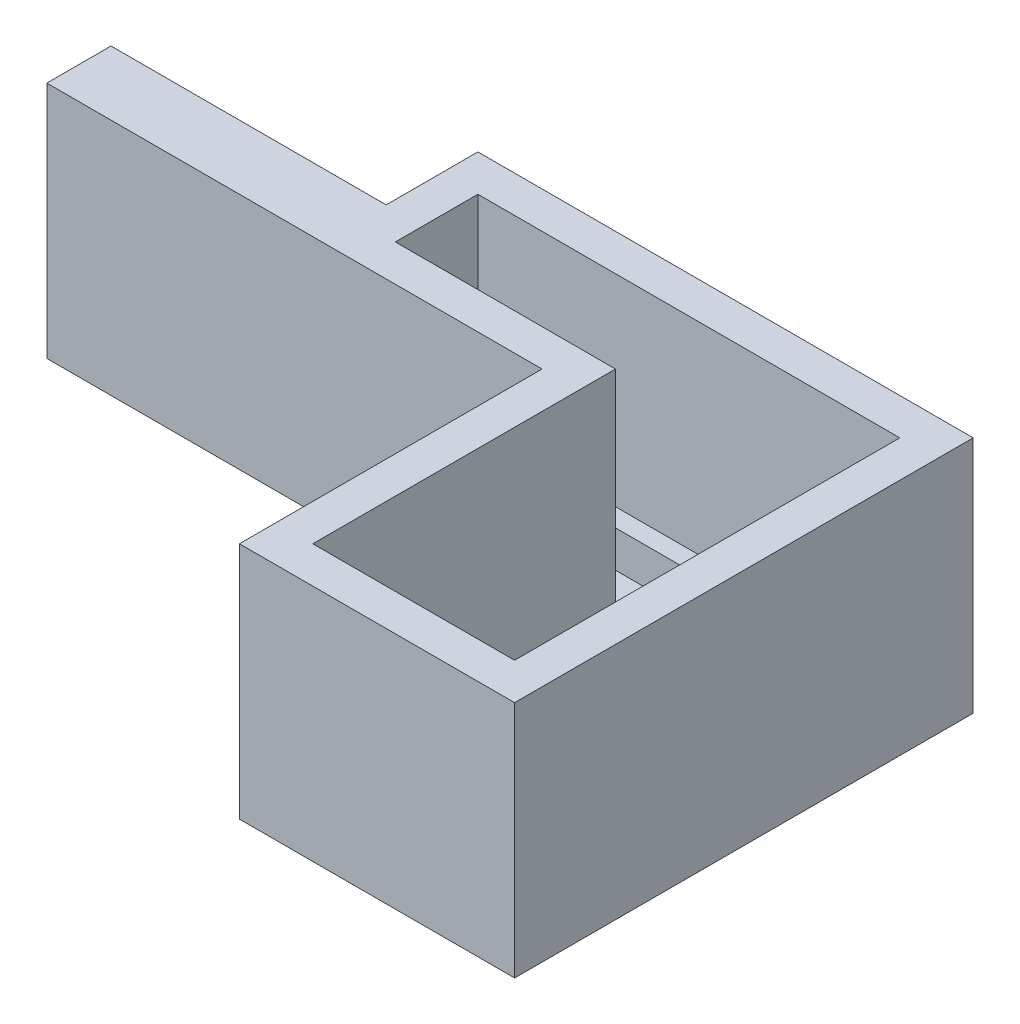
ISO-10303-21;
HEADER;
FILE_DESCRIPTION(('STEP AP214'),'2;1');
FILE_NAME('part.step','',(''),(''),'','','');
FILE_SCHEMA(('AUTOMOTIVE_DESIGN { 1 0 10303 214 1 1 1 1 }'));
ENDSEC;
DATA;
#1=APPLICATION_CONTEXT('core data for automotive mechanical design processes');
#2=APPLICATION_PROTOCOL_DEFINITION('international standard','automotive_design',2000,#1);
#3=PRODUCT_CONTEXT('',#1,'mechanical');
#4=PRODUCT('Part','Part','',(#3));
#5=PRODUCT_RELATED_PRODUCT_CATEGORY('part','',(#4));
#6=PRODUCT_DEFINITION_FORMATION('','',#4);
#7=PRODUCT_DEFINITION_CONTEXT('part definition',#1,'design');
#8=PRODUCT_DEFINITION('design','',#6,#7);
#9=PRODUCT_DEFINITION_SHAPE('','',#8);
#10=(LENGTH_UNIT() NAMED_UNIT(*) SI_UNIT(.MILLI.,.METRE.));
#11=(NAMED_UNIT(*) PLANE_ANGLE_UNIT() SI_UNIT($,.RADIAN.));
#12=(NAMED_UNIT(*) SI_UNIT($,.STERADIAN.) SOLID_ANGLE_UNIT());
#13=UNCERTAINTY_MEASURE_WITH_UNIT(LENGTH_MEASURE(1.E-05),#10,'distance_accuracy_value','');
#14=(GEOMETRIC_REPRESENTATION_CONTEXT(3) GLOBAL_UNCERTAINTY_ASSIGNED_CONTEXT((#13)) GLOBAL_UNIT_ASSIGNED_CONTEXT((#10,
#11,#12)) REPRESENTATION_CONTEXT('',''));
#15=CARTESIAN_POINT('',(0.,0.,0.));
#16=DIRECTION('',(0.,0.,1.));
#17=DIRECTION('',(1.,0.,0.));
#18=AXIS2_PLACEMENT_3D('',#15,#16,#17);
#19=CARTESIAN_POINT('',(0.,13.,0.));
#20=DIRECTION('',(-1.,0.,0.));
#21=DIRECTION('',(0.,0.,1.));
#22=AXIS2_PLACEMENT_3D('',#19,#20,#21);
#23=PLANE('',#22);
#24=DIRECTION('',(0.,0.,-1.));
#25=VECTOR('',#24,1.);
#26=CARTESIAN_POINT('',(0.,0.,0.));
#27=LINE('',#26,#25);
#28=CARTESIAN_POINT('',(0.,0.,11.));
#29=VERTEX_POINT('',#28);
#30=CARTESIAN_POINT('',(0.,0.,-14.));
#31=VERTEX_POINT('',#30);
#32=EDGE_CURVE('E244',#29,#31,#27,.T.);
#33=ORIENTED_EDGE('',*,*,#32,.T.);
#34=DIRECTION('',(0.,-1.,0.));
#35=VECTOR('',#34,1.);
#36=CARTESIAN_POINT('',(0.,13.,-14.));
#37=LINE('',#36,#35);
#38=CARTESIAN_POINT('',(0.,13.,-14.));
#39=VERTEX_POINT('',#38);
#40=EDGE_CURVE('E12',#39,#31,#37,.T.);
#41=ORIENTED_EDGE('',*,*,#40,.F.);
#42=DIRECTION('',(0.,0.,-1.));
#43=VECTOR('',#42,1.);
#44=CARTESIAN_POINT('',(0.,13.,0.));
#45=LINE('',#44,#43);
#46=CARTESIAN_POINT('',(0.,13.,11.));
#47=VERTEX_POINT('',#46);
#48=EDGE_CURVE('E245',#47,#39,#45,.T.);
#49=ORIENTED_EDGE('',*,*,#48,.F.);
#50=DIRECTION('',(0.,-1.,0.));
#51=VECTOR('',#50,1.);
#52=CARTESIAN_POINT('',(0.,13.,11.));
#53=LINE('',#52,#51);
#54=EDGE_CURVE('E262',#47,#29,#53,.T.);
#55=ORIENTED_EDGE('',*,*,#54,.T.);
#56=EDGE_LOOP('',(#33,#41,#49,#55));
#57=FACE_BOUND('',#56,.T.);
#58=ADVANCED_FACE('F37',(#57),#23,.F.);
#59=CARTESIAN_POINT('',(0.,13.,-14.));
#60=DIRECTION('',(0.,0.,1.));
#61=DIRECTION('',(1.,0.,0.));
#62=AXIS2_PLACEMENT_3D('',#59,#60,#61);
#63=PLANE('',#62);
#64=DIRECTION('',(-1.,0.,0.));
#65=VECTOR('',#64,1.);
#66=CARTESIAN_POINT('',(0.,0.,-14.));
#67=LINE('',#66,#65);
#68=CARTESIAN_POINT('',(-27.,0.,-14.));
#69=VERTEX_POINT('',#68);
#70=EDGE_CURVE('E264',#31,#69,#67,.T.);
#71=ORIENTED_EDGE('',*,*,#70,.T.);
#72=DIRECTION('',(0.,-1.,0.));
#73=VECTOR('',#72,1.);
#74=CARTESIAN_POINT('',(-27.,13.,-14.));
#75=LINE('',#74,#73);
#76=CARTESIAN_POINT('',(-27.,13.,-14.));
#77=VERTEX_POINT('',#76);
#78=EDGE_CURVE('E44',#77,#69,#75,.T.);
#79=ORIENTED_EDGE('',*,*,#78,.F.);
#80=DIRECTION('',(-1.,0.,0.));
#81=VECTOR('',#80,1.);
#82=CARTESIAN_POINT('',(0.,13.,-14.));
#83=LINE('',#82,#81);
#84=EDGE_CURVE('E247',#39,#77,#83,.T.);
#85=ORIENTED_EDGE('',*,*,#84,.F.);
#86=ORIENTED_EDGE('',*,*,#40,.T.);
#87=EDGE_LOOP('',(#71,#79,#85,#86));
#88=FACE_BOUND('',#87,.T.);
#89=ADVANCED_FACE('F323',(#88),#63,.F.);
#90=CARTESIAN_POINT('',(-27.,13.,-14.));
#91=DIRECTION('',(1.,0.,0.));
#92=DIRECTION('',(0.,0.,-1.));
#93=AXIS2_PLACEMENT_3D('',#90,#91,#92);
#94=PLANE('',#93);
#95=DIRECTION('',(0.,0.,1.));
#96=VECTOR('',#95,1.);
#97=CARTESIAN_POINT('',(-27.,0.,-14.));
#98=LINE('',#97,#96);
#99=CARTESIAN_POINT('',(-27.,0.,-9.00000000000001));
#100=VERTEX_POINT('',#99);
#101=EDGE_CURVE('E266',#69,#100,#98,.T.);
#102=ORIENTED_EDGE('',*,*,#101,.T.);
#103=DIRECTION('',(0.,-1.,0.));
#104=VECTOR('',#103,1.);
#105=CARTESIAN_POINT('',(-27.,13.,-9.00000000000001));
#106=LINE('',#105,#104);
#107=CARTESIAN_POINT('',(-27.,13.,-9.00000000000001));
#108=VERTEX_POINT('',#107);
#109=EDGE_CURVE('E292',#108,#100,#106,.T.);
#110=ORIENTED_EDGE('',*,*,#109,.F.);
#111=DIRECTION('',(0.,0.,1.));
#112=VECTOR('',#111,1.);
#113=CARTESIAN_POINT('',(-27.,13.,-14.));
#114=LINE('',#113,#112);
#115=EDGE_CURVE('E250',#77,#108,#114,.T.);
#116=ORIENTED_EDGE('',*,*,#115,.F.);
#117=ORIENTED_EDGE('',*,*,#78,.T.);
#118=EDGE_LOOP('',(#102,#110,#116,#117));
#119=FACE_BOUND('',#118,.T.);
#120=ADVANCED_FACE('F299',(#119),#94,.F.);
#121=CARTESIAN_POINT('',(-27.,13.,-9.00000000000001));
#122=DIRECTION('',(0.,0.,1.));
#123=DIRECTION('',(1.,0.,0.));
#124=AXIS2_PLACEMENT_3D('',#121,#122,#123);
#125=PLANE('',#124);
#126=DIRECTION('',(-1.,0.,0.));
#127=VECTOR('',#126,1.);
#128=CARTESIAN_POINT('',(-27.,0.,-9.00000000000001));
#129=LINE('',#128,#127);
#130=CARTESIAN_POINT('',(-42.,0.,-9.00000000000001));
#131=VERTEX_POINT('',#130);
#132=EDGE_CURVE('E268',#100,#131,#129,.T.);
#133=ORIENTED_EDGE('',*,*,#132,.T.);
#134=DIRECTION('',(0.,-1.,0.));
#135=VECTOR('',#134,1.);
#136=CARTESIAN_POINT('',(-42.,13.,-9.00000000000001));
#137=LINE('',#136,#135);
#138=CARTESIAN_POINT('',(-42.,13.,-9.00000000000001));
#139=VERTEX_POINT('',#138);
#140=EDGE_CURVE('E289',#139,#131,#137,.T.);
#141=ORIENTED_EDGE('',*,*,#140,.F.);
#142=DIRECTION('',(-1.,0.,0.));
#143=VECTOR('',#142,1.);
#144=CARTESIAN_POINT('',(-27.,13.,-9.00000000000001));
#145=LINE('',#144,#143);
#146=EDGE_CURVE('E252',#108,#139,#145,.T.);
#147=ORIENTED_EDGE('',*,*,#146,.F.);
#148=ORIENTED_EDGE('',*,*,#109,.T.);
#149=EDGE_LOOP('',(#133,#141,#147,#148));
#150=FACE_BOUND('',#149,.T.);
#151=ADVANCED_FACE('F311',(#150),#125,.F.);
#152=CARTESIAN_POINT('',(-42.,13.,-9.00000000000001));
#153=DIRECTION('',(1.,0.,0.));
#154=DIRECTION('',(0.,0.,-1.));
#155=AXIS2_PLACEMENT_3D('',#152,#153,#154);
#156=PLANE('',#155);
#157=DIRECTION('',(0.,0.,1.));
#158=VECTOR('',#157,1.);
#159=CARTESIAN_POINT('',(-42.,0.,-9.00000000000001));
#160=LINE('',#159,#158);
#161=CARTESIAN_POINT('',(-42.,0.,-5.50000000000001));
#162=VERTEX_POINT('',#161);
#163=EDGE_CURVE('E270',#131,#162,#160,.T.);
#164=ORIENTED_EDGE('',*,*,#163,.T.);
#165=DIRECTION('',(0.,-1.,0.));
#166=VECTOR('',#165,1.);
#167=CARTESIAN_POINT('',(-42.,13.,-5.50000000000001));
#168=LINE('',#167,#166);
#169=CARTESIAN_POINT('',(-42.,13.,-5.50000000000001));
#170=VERTEX_POINT('',#169);
#171=EDGE_CURVE('E286',#170,#162,#168,.T.);
#172=ORIENTED_EDGE('',*,*,#171,.F.);
#173=DIRECTION('',(0.,0.,1.));
#174=VECTOR('',#173,1.);
#175=CARTESIAN_POINT('',(-42.,13.,-9.00000000000001));
#176=LINE('',#175,#174);
#177=EDGE_CURVE('E254',#139,#170,#176,.T.);
#178=ORIENTED_EDGE('',*,*,#177,.F.);
#179=ORIENTED_EDGE('',*,*,#140,.T.);
#180=EDGE_LOOP('',(#164,#172,#178,#179));
#181=FACE_BOUND('',#180,.T.);
#182=ADVANCED_FACE('F315',(#181),#156,.F.);
#183=CARTESIAN_POINT('',(-42.,13.,-5.50000000000001));
#184=DIRECTION('',(0.,0.,-1.));
#185=DIRECTION('',(-1.,0.,0.));
#186=AXIS2_PLACEMENT_3D('',#183,#184,#185);
#187=PLANE('',#186);
#188=DIRECTION('',(1.,0.,0.));
#189=VECTOR('',#188,1.);
#190=CARTESIAN_POINT('',(-42.,0.,-5.50000000000001));
#191=LINE('',#190,#189);
#192=CARTESIAN_POINT('',(-15.,0.,-5.50000000000001));
#193=VERTEX_POINT('',#192);
#194=EDGE_CURVE('E272',#162,#193,#191,.T.);
#195=ORIENTED_EDGE('',*,*,#194,.T.);
#196=DIRECTION('',(0.,-1.,0.));
#197=VECTOR('',#196,1.);
#198=CARTESIAN_POINT('',(-15.,13.,-5.50000000000001));
#199=LINE('',#198,#197);
#200=CARTESIAN_POINT('',(-15.,13.,-5.50000000000001));
#201=VERTEX_POINT('',#200);
#202=EDGE_CURVE('E283',#201,#193,#199,.T.);
#203=ORIENTED_EDGE('',*,*,#202,.F.);
#204=DIRECTION('',(1.,0.,0.));
#205=VECTOR('',#204,1.);
#206=CARTESIAN_POINT('',(-42.,13.,-5.50000000000001));
#207=LINE('',#206,#205);
#208=EDGE_CURVE('E256',#170,#201,#207,.T.);
#209=ORIENTED_EDGE('',*,*,#208,.F.);
#210=ORIENTED_EDGE('',*,*,#171,.T.);
#211=EDGE_LOOP('',(#195,#203,#209,#210));
#212=FACE_BOUND('',#211,.T.);
#213=ADVANCED_FACE('F336',(#212),#187,.F.);
#214=CARTESIAN_POINT('',(-15.,13.,11.));
#215=DIRECTION('',(1.,0.,0.));
#216=DIRECTION('',(0.,0.,-1.));
#217=AXIS2_PLACEMENT_3D('',#214,#215,#216);
#218=PLANE('',#217);
#219=DIRECTION('',(0.,0.,1.));
#220=VECTOR('',#219,1.);
#221=CARTESIAN_POINT('',(-15.,0.,11.));
#222=LINE('',#221,#220);
#223=CARTESIAN_POINT('',(-15.,0.,11.));
#224=VERTEX_POINT('',#223);
#225=EDGE_CURVE('E274',#193,#224,#222,.T.);
#226=ORIENTED_EDGE('',*,*,#225,.T.);
#227=DIRECTION('',(0.,-1.,0.));
#228=VECTOR('',#227,1.);
#229=CARTESIAN_POINT('',(-15.,13.,11.));
#230=LINE('',#229,#228);
#231=CARTESIAN_POINT('',(-15.,13.,11.));
#232=VERTEX_POINT('',#231);
#233=EDGE_CURVE('E280',#232,#224,#230,.T.);
#234=ORIENTED_EDGE('',*,*,#233,.F.);
#235=DIRECTION('',(0.,0.,1.));
#236=VECTOR('',#235,1.);
#237=CARTESIAN_POINT('',(-15.,13.,11.));
#238=LINE('',#237,#236);
#239=EDGE_CURVE('E258',#201,#232,#238,.T.);
#240=ORIENTED_EDGE('',*,*,#239,.F.);
#241=ORIENTED_EDGE('',*,*,#202,.T.);
#242=EDGE_LOOP('',(#226,#234,#240,#241));
#243=FACE_BOUND('',#242,.T.);
#244=ADVANCED_FACE('F334',(#243),#218,.F.);
#245=CARTESIAN_POINT('',(0.,13.,11.));
#246=DIRECTION('',(0.,0.,-1.));
#247=DIRECTION('',(-1.,0.,0.));
#248=AXIS2_PLACEMENT_3D('',#245,#246,#247);
#249=PLANE('',#248);
#250=DIRECTION('',(1.,0.,0.));
#251=VECTOR('',#250,1.);
#252=CARTESIAN_POINT('',(0.,0.,11.));
#253=LINE('',#252,#251);
#254=EDGE_CURVE('E248',#224,#29,#253,.T.);
#255=ORIENTED_EDGE('',*,*,#254,.T.);
#256=ORIENTED_EDGE('',*,*,#54,.F.);
#257=DIRECTION('',(1.,0.,0.));
#258=VECTOR('',#257,1.);
#259=CARTESIAN_POINT('',(0.,13.,11.));
#260=LINE('',#259,#258);
#261=EDGE_CURVE('E260',#232,#47,#260,.T.);
#262=ORIENTED_EDGE('',*,*,#261,.F.);
#263=ORIENTED_EDGE('',*,*,#233,.T.);
#264=EDGE_LOOP('',(#255,#256,#262,#263));
#265=FACE_BOUND('',#264,.T.);
#266=ADVANCED_FACE('F329',(#265),#249,.F.);
#267=CARTESIAN_POINT('',(0.,13.,0.));
#268=DIRECTION('',(0.,-1.,0.));
#269=DIRECTION('',(0.,0.,-1.));
#270=AXIS2_PLACEMENT_3D('',#267,#268,#269);
#271=PLANE('',#270);
#272=DIRECTION('',(0.,0.,1.));
#273=VECTOR('',#272,1.);
#274=CARTESIAN_POINT('',(-25.,13.,-12.));
#275=LINE('',#274,#273);
#276=CARTESIAN_POINT('',(-25.,13.,-12.));
#277=VERTEX_POINT('',#276);
#278=CARTESIAN_POINT('',(-25.,13.,-7.50000000000001));
#279=VERTEX_POINT('',#278);
#280=EDGE_CURVE('E206',#277,#279,#275,.T.);
#281=ORIENTED_EDGE('',*,*,#280,.F.);
#282=DIRECTION('',(-1.,0.,0.));
#283=VECTOR('',#282,1.);
#284=CARTESIAN_POINT('',(-2.,13.,-12.));
#285=LINE('',#284,#283);
#286=CARTESIAN_POINT('',(-2.,13.,-12.));
#287=VERTEX_POINT('',#286);
#288=EDGE_CURVE('E209',#287,#277,#285,.T.);
#289=ORIENTED_EDGE('',*,*,#288,.F.);
#290=DIRECTION('',(0.,0.,-1.));
#291=VECTOR('',#290,1.);
#292=CARTESIAN_POINT('',(-2.,13.,8.99999999999999));
#293=LINE('',#292,#291);
#294=CARTESIAN_POINT('',(-2.,13.,8.99999999999999));
#295=VERTEX_POINT('',#294);
#296=EDGE_CURVE('E196',#295,#287,#293,.T.);
#297=ORIENTED_EDGE('',*,*,#296,.F.);
#298=DIRECTION('',(1.,0.,0.));
#299=VECTOR('',#298,1.);
#300=CARTESIAN_POINT('',(-13.,13.,8.99999999999999));
#301=LINE('',#300,#299);
#302=CARTESIAN_POINT('',(-13.,13.,8.99999999999999));
#303=VERTEX_POINT('',#302);
#304=EDGE_CURVE('E197',#303,#295,#301,.T.);
#305=ORIENTED_EDGE('',*,*,#304,.F.);
#306=DIRECTION('',(0.,0.,1.));
#307=VECTOR('',#306,1.);
#308=CARTESIAN_POINT('',(-13.,13.,-7.50000000000001));
#309=LINE('',#308,#307);
#310=CARTESIAN_POINT('',(-13.,13.,-7.50000000000001));
#311=VERTEX_POINT('',#310);
#312=EDGE_CURVE('E200',#311,#303,#309,.T.);
#313=ORIENTED_EDGE('',*,*,#312,.F.);
#314=DIRECTION('',(1.,0.,0.));
#315=VECTOR('',#314,1.);
#316=CARTESIAN_POINT('',(-25.,13.,-7.50000000000001));
#317=LINE('',#316,#315);
#318=EDGE_CURVE('E203',#279,#311,#317,.T.);
#319=ORIENTED_EDGE('',*,*,#318,.F.);
#320=EDGE_LOOP('',(#281,#289,#297,#305,#313,#319));
#321=FACE_BOUND('',#320,.T.);
#322=ORIENTED_EDGE('',*,*,#48,.T.);
#323=ORIENTED_EDGE('',*,*,#84,.T.);
#324=ORIENTED_EDGE('',*,*,#115,.T.);
#325=ORIENTED_EDGE('',*,*,#146,.T.);
#326=ORIENTED_EDGE('',*,*,#177,.T.);
#327=ORIENTED_EDGE('',*,*,#208,.T.);
#328=ORIENTED_EDGE('',*,*,#239,.T.);
#329=ORIENTED_EDGE('',*,*,#261,.T.);
#330=EDGE_LOOP('',(#322,#323,#324,#325,#326,#327,#328,#329));
#331=FACE_BOUND('',#330,.T.);
#332=ADVANCED_FACE('F319',(#321,#331),#271,.F.);
#333=CARTESIAN_POINT('',(0.,0.,0.));
#334=DIRECTION('',(0.,-1.,0.));
#335=DIRECTION('',(0.,0.,-1.));
#336=AXIS2_PLACEMENT_3D('',#333,#334,#335);
#337=PLANE('',#336);
#338=CARTESIAN_POINT('',(-7.5,0.,-8.00000000000002));
#339=DIRECTION('',(0.,-1.,0.));
#340=DIRECTION('',(0.,0.,-1.));
#341=AXIS2_PLACEMENT_3D('',#338,#339,#340);
#342=CIRCLE('',#341,1.65);
#343=CARTESIAN_POINT('',(-7.5,0.,-9.65000000000002));
#344=VERTEX_POINT('',#343);
#345=EDGE_CURVE('E530',#344,#344,#342,.T.);
#346=ORIENTED_EDGE('',*,*,#345,.F.);
#347=EDGE_LOOP('',(#346));
#348=FACE_BOUND('',#347,.T.);
#349=CARTESIAN_POINT('',(-7.5,0.,4.99999999999999));
#350=DIRECTION('',(0.,-1.,0.));
#351=DIRECTION('',(0.,0.,-1.));
#352=AXIS2_PLACEMENT_3D('',#349,#350,#351);
#353=CIRCLE('',#352,1.65);
#354=CARTESIAN_POINT('',(-7.5,0.,3.34999999999999));
#355=VERTEX_POINT('',#354);
#356=EDGE_CURVE('E534',#355,#355,#353,.T.);
#357=ORIENTED_EDGE('',*,*,#356,.F.);
#358=EDGE_LOOP('',(#357));
#359=FACE_BOUND('',#358,.T.);
#360=DIRECTION('',(0.,0.,-1.));
#361=VECTOR('',#360,1.);
#362=CARTESIAN_POINT('',(-23.,0.,0.));
#363=LINE('',#362,#361);
#364=CARTESIAN_POINT('',(-23.,0.,-9.00000000000001));
#365=VERTEX_POINT('',#364);
#366=CARTESIAN_POINT('',(-23.,0.,-11.));
#367=VERTEX_POINT('',#366);
#368=EDGE_CURVE('E194',#365,#367,#363,.T.);
#369=ORIENTED_EDGE('',*,*,#368,.F.);
#370=DIRECTION('',(-1.,0.,0.));
#371=VECTOR('',#370,1.);
#372=CARTESIAN_POINT('',(0.,0.,-9.00000000000001));
#373=LINE('',#372,#371);
#374=CARTESIAN_POINT('',(-9.,0.,-9.00000000000001));
#375=VERTEX_POINT('',#374);
#376=EDGE_CURVE('E187',#375,#365,#373,.T.);
#377=ORIENTED_EDGE('',*,*,#376,.F.);
#378=DIRECTION('',(0.,0.,1.));
#379=VECTOR('',#378,1.);
#380=CARTESIAN_POINT('',(-8.99999999999998,0.,0.));
#381=LINE('',#380,#379);
#382=CARTESIAN_POINT('',(-9.,0.,-11.));
#383=VERTEX_POINT('',#382);
#384=EDGE_CURVE('E167',#383,#375,#381,.T.);
#385=ORIENTED_EDGE('',*,*,#384,.F.);
#386=DIRECTION('',(1.,0.,0.));
#387=VECTOR('',#386,1.);
#388=CARTESIAN_POINT('',(0.,0.,-11.));
#389=LINE('',#388,#387);
#390=EDGE_CURVE('E192',#367,#383,#389,.T.);
#391=ORIENTED_EDGE('',*,*,#390,.F.);
#392=EDGE_LOOP('',(#369,#377,#385,#391));
#393=FACE_BOUND('',#392,.T.);
#394=ORIENTED_EDGE('',*,*,#32,.F.);
#395=ORIENTED_EDGE('',*,*,#254,.F.);
#396=ORIENTED_EDGE('',*,*,#225,.F.);
#397=ORIENTED_EDGE('',*,*,#194,.F.);
#398=ORIENTED_EDGE('',*,*,#163,.F.);
#399=ORIENTED_EDGE('',*,*,#132,.F.);
#400=ORIENTED_EDGE('',*,*,#101,.F.);
#401=ORIENTED_EDGE('',*,*,#70,.F.);
#402=EDGE_LOOP('',(#394,#395,#396,#397,#398,#399,#400,#401));
#403=FACE_BOUND('',#402,.T.);
#404=ADVANCED_FACE('F306',(#348,#359,#393,#403),#337,.T.);
#405=CARTESIAN_POINT('',(0.,2.,0.));
#406=DIRECTION('',(0.,-1.,0.));
#407=DIRECTION('',(0.,0.,-1.));
#408=AXIS2_PLACEMENT_3D('',#405,#406,#407);
#409=PLANE('',#408);
#410=CARTESIAN_POINT('',(-7.5,2.,-8.00000000000002));
#411=DIRECTION('',(0.,1.,0.));
#412=DIRECTION('',(0.,0.,1.));
#413=AXIS2_PLACEMENT_3D('',#410,#411,#412);
#414=CIRCLE('',#413,1.65);
#415=CARTESIAN_POINT('',(-7.5,2.,-6.35000000000002));
#416=VERTEX_POINT('',#415);
#417=EDGE_CURVE('E533',#416,#416,#414,.T.);
#418=ORIENTED_EDGE('',*,*,#417,.F.);
#419=EDGE_LOOP('',(#418));
#420=FACE_BOUND('',#419,.T.);
#421=CARTESIAN_POINT('',(-7.5,2.,4.99999999999999));
#422=DIRECTION('',(0.,1.,0.));
#423=DIRECTION('',(0.,0.,1.));
#424=AXIS2_PLACEMENT_3D('',#421,#422,#423);
#425=CIRCLE('',#424,1.65);
#426=CARTESIAN_POINT('',(-7.5,2.,6.64999999999999));
#427=VERTEX_POINT('',#426);
#428=EDGE_CURVE('E535',#427,#427,#425,.T.);
#429=ORIENTED_EDGE('',*,*,#428,.F.);
#430=EDGE_LOOP('',(#429));
#431=FACE_BOUND('',#430,.T.);
#432=DIRECTION('',(1.,0.,0.));
#433=VECTOR('',#432,1.);
#434=CARTESIAN_POINT('',(-23.,2.,-9.00000000000001));
#435=LINE('',#434,#433);
#436=CARTESIAN_POINT('',(-23.,2.,-9.00000000000001));
#437=VERTEX_POINT('',#436);
#438=CARTESIAN_POINT('',(-9.,2.,-9.00000000000001));
#439=VERTEX_POINT('',#438);
#440=EDGE_CURVE('E173',#437,#439,#435,.T.);
#441=ORIENTED_EDGE('',*,*,#440,.F.);
#442=DIRECTION('',(0.,0.,1.));
#443=VECTOR('',#442,1.);
#444=CARTESIAN_POINT('',(-23.,2.,-11.));
#445=LINE('',#444,#443);
#446=CARTESIAN_POINT('',(-23.,2.,-11.));
#447=VERTEX_POINT('',#446);
#448=EDGE_CURVE('E59',#447,#437,#445,.T.);
#449=ORIENTED_EDGE('',*,*,#448,.F.);
#450=DIRECTION('',(-1.,0.,0.));
#451=VECTOR('',#450,1.);
#452=CARTESIAN_POINT('',(-23.,2.,-11.));
#453=LINE('',#452,#451);
#454=CARTESIAN_POINT('',(-9.,2.,-11.));
#455=VERTEX_POINT('',#454);
#456=EDGE_CURVE('E180',#455,#447,#453,.T.);
#457=ORIENTED_EDGE('',*,*,#456,.F.);
#458=DIRECTION('',(0.,0.,-1.));
#459=VECTOR('',#458,1.);
#460=CARTESIAN_POINT('',(-9.,2.,-11.));
#461=LINE('',#460,#459);
#462=EDGE_CURVE('E164',#439,#455,#461,.T.);
#463=ORIENTED_EDGE('',*,*,#462,.F.);
#464=EDGE_LOOP('',(#441,#449,#457,#463));
#465=FACE_BOUND('',#464,.T.);
#466=DIRECTION('',(0.,0.,-1.));
#467=VECTOR('',#466,1.);
#468=CARTESIAN_POINT('',(-2.,2.,8.99999999999999));
#469=LINE('',#468,#467);
#470=CARTESIAN_POINT('',(-2.,2.,8.99999999999999));
#471=VERTEX_POINT('',#470);
#472=CARTESIAN_POINT('',(-2.,2.,-12.));
#473=VERTEX_POINT('',#472);
#474=EDGE_CURVE('E217',#471,#473,#469,.T.);
#475=ORIENTED_EDGE('',*,*,#474,.T.);
#476=DIRECTION('',(-1.,0.,0.));
#477=VECTOR('',#476,1.);
#478=CARTESIAN_POINT('',(-2.,2.,-12.));
#479=LINE('',#478,#477);
#480=CARTESIAN_POINT('',(-25.,2.,-12.));
#481=VERTEX_POINT('',#480);
#482=EDGE_CURVE('E199',#473,#481,#479,.T.);
#483=ORIENTED_EDGE('',*,*,#482,.T.);
#484=DIRECTION('',(0.,0.,1.));
#485=VECTOR('',#484,1.);
#486=CARTESIAN_POINT('',(-25.,2.,-12.));
#487=LINE('',#486,#485);
#488=CARTESIAN_POINT('',(-25.,2.,-7.50000000000001));
#489=VERTEX_POINT('',#488);
#490=EDGE_CURVE('E234',#481,#489,#487,.T.);
#491=ORIENTED_EDGE('',*,*,#490,.T.);
#492=DIRECTION('',(1.,0.,0.));
#493=VECTOR('',#492,1.);
#494=CARTESIAN_POINT('',(-25.,2.,-7.50000000000001));
#495=LINE('',#494,#493);
#496=CARTESIAN_POINT('',(-13.,2.,-7.50000000000001));
#497=VERTEX_POINT('',#496);
#498=EDGE_CURVE('E230',#489,#497,#495,.T.);
#499=ORIENTED_EDGE('',*,*,#498,.T.);
#500=DIRECTION('',(0.,0.,1.));
#501=VECTOR('',#500,1.);
#502=CARTESIAN_POINT('',(-13.,2.,-7.50000000000001));
#503=LINE('',#502,#501);
#504=CARTESIAN_POINT('',(-13.,2.,8.99999999999998));
#505=VERTEX_POINT('',#504);
#506=EDGE_CURVE('E226',#497,#505,#503,.T.);
#507=ORIENTED_EDGE('',*,*,#506,.T.);
#508=DIRECTION('',(1.,0.,0.));
#509=VECTOR('',#508,1.);
#510=CARTESIAN_POINT('',(-13.,2.,8.99999999999999));
#511=LINE('',#510,#509);
#512=EDGE_CURVE('E222',#505,#471,#511,.T.);
#513=ORIENTED_EDGE('',*,*,#512,.T.);
#514=EDGE_LOOP('',(#475,#483,#491,#499,#507,#513));
#515=FACE_BOUND('',#514,.T.);
#516=ADVANCED_FACE('F177',(#420,#431,#465,#515),#409,.F.);
#517=CARTESIAN_POINT('',(-2.,-31.1448230047949,-12.));
#518=DIRECTION('',(0.,0.,-1.));
#519=DIRECTION('',(-1.,0.,0.));
#520=AXIS2_PLACEMENT_3D('',#517,#518,#519);
#521=PLANE('',#520);
#522=DIRECTION('',(0.,1.,0.));
#523=VECTOR('',#522,1.);
#524=CARTESIAN_POINT('',(-2.,-31.1448230047949,-12.));
#525=LINE('',#524,#523);
#526=EDGE_CURVE('E220',#473,#287,#525,.T.);
#527=ORIENTED_EDGE('',*,*,#526,.T.);
#528=ORIENTED_EDGE('',*,*,#288,.T.);
#529=DIRECTION('',(0.,1.,0.));
#530=VECTOR('',#529,1.);
#531=CARTESIAN_POINT('',(-25.,-31.1448230047949,-12.));
#532=LINE('',#531,#530);
#533=EDGE_CURVE('E216',#481,#277,#532,.T.);
#534=ORIENTED_EDGE('',*,*,#533,.F.);
#535=ORIENTED_EDGE('',*,*,#482,.F.);
#536=EDGE_LOOP('',(#527,#528,#534,#535));
#537=FACE_BOUND('',#536,.T.);
#538=ADVANCED_FACE('F397',(#537),#521,.F.);
#539=CARTESIAN_POINT('',(-25.,-31.1448230047949,-12.));
#540=DIRECTION('',(-1.,0.,0.));
#541=DIRECTION('',(0.,0.,1.));
#542=AXIS2_PLACEMENT_3D('',#539,#540,#541);
#543=PLANE('',#542);
#544=ORIENTED_EDGE('',*,*,#533,.T.);
#545=ORIENTED_EDGE('',*,*,#280,.T.);
#546=DIRECTION('',(0.,1.,0.));
#547=VECTOR('',#546,1.);
#548=CARTESIAN_POINT('',(-25.,-31.1448230047949,-7.50000000000001));
#549=LINE('',#548,#547);
#550=EDGE_CURVE('E233',#489,#279,#549,.T.);
#551=ORIENTED_EDGE('',*,*,#550,.F.);
#552=ORIENTED_EDGE('',*,*,#490,.F.);
#553=EDGE_LOOP('',(#544,#545,#551,#552));
#554=FACE_BOUND('',#553,.T.);
#555=ADVANCED_FACE('F402',(#554),#543,.F.);
#556=CARTESIAN_POINT('',(-25.,-31.1448230047949,-7.50000000000001));
#557=DIRECTION('',(0.,0.,1.));
#558=DIRECTION('',(1.,0.,0.));
#559=AXIS2_PLACEMENT_3D('',#556,#557,#558);
#560=PLANE('',#559);
#561=ORIENTED_EDGE('',*,*,#550,.T.);
#562=ORIENTED_EDGE('',*,*,#318,.T.);
#563=DIRECTION('',(0.,1.,0.));
#564=VECTOR('',#563,1.);
#565=CARTESIAN_POINT('',(-13.,-31.1448230047949,-7.50000000000001));
#566=LINE('',#565,#564);
#567=EDGE_CURVE('E229',#497,#311,#566,.T.);
#568=ORIENTED_EDGE('',*,*,#567,.F.);
#569=ORIENTED_EDGE('',*,*,#498,.F.);
#570=EDGE_LOOP('',(#561,#562,#568,#569));
#571=FACE_BOUND('',#570,.T.);
#572=ADVANCED_FACE('F414',(#571),#560,.F.);
#573=CARTESIAN_POINT('',(-13.,-31.1448230047949,-7.50000000000001));
#574=DIRECTION('',(-1.,0.,0.));
#575=DIRECTION('',(0.,0.,1.));
#576=AXIS2_PLACEMENT_3D('',#573,#574,#575);
#577=PLANE('',#576);
#578=ORIENTED_EDGE('',*,*,#567,.T.);
#579=ORIENTED_EDGE('',*,*,#312,.T.);
#580=DIRECTION('',(0.,1.,0.));
#581=VECTOR('',#580,1.);
#582=CARTESIAN_POINT('',(-13.,-31.1448230047949,8.99999999999999));
#583=LINE('',#582,#581);
#584=EDGE_CURVE('E225',#505,#303,#583,.T.);
#585=ORIENTED_EDGE('',*,*,#584,.F.);
#586=ORIENTED_EDGE('',*,*,#506,.F.);
#587=EDGE_LOOP('',(#578,#579,#585,#586));
#588=FACE_BOUND('',#587,.T.);
#589=ADVANCED_FACE('F424',(#588),#577,.F.);
#590=CARTESIAN_POINT('',(-13.,-31.1448230047949,8.99999999999999));
#591=DIRECTION('',(0.,0.,1.));
#592=DIRECTION('',(1.,0.,0.));
#593=AXIS2_PLACEMENT_3D('',#590,#591,#592);
#594=PLANE('',#593);
#595=ORIENTED_EDGE('',*,*,#584,.T.);
#596=ORIENTED_EDGE('',*,*,#304,.T.);
#597=DIRECTION('',(0.,1.,0.));
#598=VECTOR('',#597,1.);
#599=CARTESIAN_POINT('',(-2.,-31.1448230047949,8.99999999999999));
#600=LINE('',#599,#598);
#601=EDGE_CURVE('E221',#471,#295,#600,.T.);
#602=ORIENTED_EDGE('',*,*,#601,.F.);
#603=ORIENTED_EDGE('',*,*,#512,.F.);
#604=EDGE_LOOP('',(#595,#596,#602,#603));
#605=FACE_BOUND('',#604,.T.);
#606=ADVANCED_FACE('F434',(#605),#594,.F.);
#607=CARTESIAN_POINT('',(-2.,-31.1448230047949,8.99999999999999));
#608=DIRECTION('',(1.,0.,0.));
#609=DIRECTION('',(0.,0.,-1.));
#610=AXIS2_PLACEMENT_3D('',#607,#608,#609);
#611=PLANE('',#610);
#612=ORIENTED_EDGE('',*,*,#601,.T.);
#613=ORIENTED_EDGE('',*,*,#296,.T.);
#614=ORIENTED_EDGE('',*,*,#526,.F.);
#615=ORIENTED_EDGE('',*,*,#474,.F.);
#616=EDGE_LOOP('',(#612,#613,#614,#615));
#617=FACE_BOUND('',#616,.T.);
#618=ADVANCED_FACE('F444',(#617),#611,.F.);
#619=CARTESIAN_POINT('',(-23.,-8.,-11.));
#620=DIRECTION('',(-1.,0.,0.));
#621=DIRECTION('',(0.,0.,1.));
#622=AXIS2_PLACEMENT_3D('',#619,#620,#621);
#623=PLANE('',#622);
#624=ORIENTED_EDGE('',*,*,#368,.T.);
#625=DIRECTION('',(0.,1.,0.));
#626=VECTOR('',#625,1.);
#627=CARTESIAN_POINT('',(-23.,-8.,-11.));
#628=LINE('',#627,#626);
#629=EDGE_CURVE('E185',#367,#447,#628,.T.);
#630=ORIENTED_EDGE('',*,*,#629,.T.);
#631=ORIENTED_EDGE('',*,*,#448,.T.);
#632=DIRECTION('',(0.,1.,0.));
#633=VECTOR('',#632,1.);
#634=CARTESIAN_POINT('',(-23.,-8.,-9.00000000000001));
#635=LINE('',#634,#633);
#636=EDGE_CURVE('E170',#365,#437,#635,.T.);
#637=ORIENTED_EDGE('',*,*,#636,.F.);
#638=EDGE_LOOP('',(#624,#630,#631,#637));
#639=FACE_BOUND('',#638,.T.);
#640=ADVANCED_FACE('F454',(#639),#623,.F.);
#641=CARTESIAN_POINT('',(-23.,-8.,-11.));
#642=DIRECTION('',(0.,0.,-1.));
#643=DIRECTION('',(-1.,0.,0.));
#644=AXIS2_PLACEMENT_3D('',#641,#642,#643);
#645=PLANE('',#644);
#646=ORIENTED_EDGE('',*,*,#390,.T.);
#647=DIRECTION('',(0.,1.,0.));
#648=VECTOR('',#647,1.);
#649=CARTESIAN_POINT('',(-9.,-8.,-11.));
#650=LINE('',#649,#648);
#651=EDGE_CURVE('E169',#383,#455,#650,.T.);
#652=ORIENTED_EDGE('',*,*,#651,.T.);
#653=ORIENTED_EDGE('',*,*,#456,.T.);
#654=ORIENTED_EDGE('',*,*,#629,.F.);
#655=EDGE_LOOP('',(#646,#652,#653,#654));
#656=FACE_BOUND('',#655,.T.);
#657=ADVANCED_FACE('F464',(#656),#645,.F.);
#658=CARTESIAN_POINT('',(-9.,-8.,-11.));
#659=DIRECTION('',(1.,0.,0.));
#660=DIRECTION('',(0.,0.,-1.));
#661=AXIS2_PLACEMENT_3D('',#658,#659,#660);
#662=PLANE('',#661);
#663=ORIENTED_EDGE('',*,*,#384,.T.);
#664=DIRECTION('',(0.,1.,0.));
#665=VECTOR('',#664,1.);
#666=CARTESIAN_POINT('',(-9.,-8.,-9.00000000000001));
#667=LINE('',#666,#665);
#668=EDGE_CURVE('E51',#375,#439,#667,.T.);
#669=ORIENTED_EDGE('',*,*,#668,.T.);
#670=ORIENTED_EDGE('',*,*,#462,.T.);
#671=ORIENTED_EDGE('',*,*,#651,.F.);
#672=EDGE_LOOP('',(#663,#669,#670,#671));
#673=FACE_BOUND('',#672,.T.);
#674=ADVANCED_FACE('F161',(#673),#662,.F.);
#675=CARTESIAN_POINT('',(-23.,-8.,-9.00000000000001));
#676=DIRECTION('',(0.,0.,1.));
#677=DIRECTION('',(1.,0.,0.));
#678=AXIS2_PLACEMENT_3D('',#675,#676,#677);
#679=PLANE('',#678);
#680=ORIENTED_EDGE('',*,*,#376,.T.);
#681=ORIENTED_EDGE('',*,*,#636,.T.);
#682=ORIENTED_EDGE('',*,*,#440,.T.);
#683=ORIENTED_EDGE('',*,*,#668,.F.);
#684=EDGE_LOOP('',(#680,#681,#682,#683));
#685=FACE_BOUND('',#684,.T.);
#686=ADVANCED_FACE('F174',(#685),#679,.F.);
#687=CARTESIAN_POINT('',(-7.5,-18.,4.99999999999999));
#688=DIRECTION('',(0.,1.,0.));
#689=DIRECTION('',(0.,0.,1.));
#690=AXIS2_PLACEMENT_3D('',#687,#688,#689);
#691=CYLINDRICAL_SURFACE('',#690,1.65);
#692=ORIENTED_EDGE('',*,*,#356,.T.);
#693=EDGE_LOOP('',(#692));
#694=FACE_BOUND('',#693,.T.);
#695=ORIENTED_EDGE('',*,*,#428,.T.);
#696=EDGE_LOOP('',(#695));
#697=FACE_BOUND('',#696,.T.);
#698=ADVANCED_FACE('F490',(#694,#697),#691,.F.);
#699=CARTESIAN_POINT('',(-7.5,-18.,-8.00000000000002));
#700=DIRECTION('',(0.,1.,0.));
#701=DIRECTION('',(0.,0.,1.));
#702=AXIS2_PLACEMENT_3D('',#699,#700,#701);
#703=CYLINDRICAL_SURFACE('',#702,1.65);
#704=ORIENTED_EDGE('',*,*,#345,.T.);
#705=EDGE_LOOP('',(#704));
#706=FACE_BOUND('',#705,.T.);
#707=ORIENTED_EDGE('',*,*,#417,.T.);
#708=EDGE_LOOP('',(#707));
#709=FACE_BOUND('',#708,.T.);
#710=ADVANCED_FACE('F513',(#706,#709),#703,.F.);
#711=CLOSED_SHELL('',(#58,#89,#120,#151,#182,#213,#244,#266,#332,#404,#516,#538,#555,#572,#589,
#606,#618,#640,#657,#674,#686,#698,#710));
#712=MANIFOLD_SOLID_BREP('B2',#711);
#713=ADVANCED_BREP_SHAPE_REPRESENTATION('',(#18,#712),#14);
#714=SHAPE_DEFINITION_REPRESENTATION(#9,#713);
ENDSEC;
END-ISO-10303-21;
